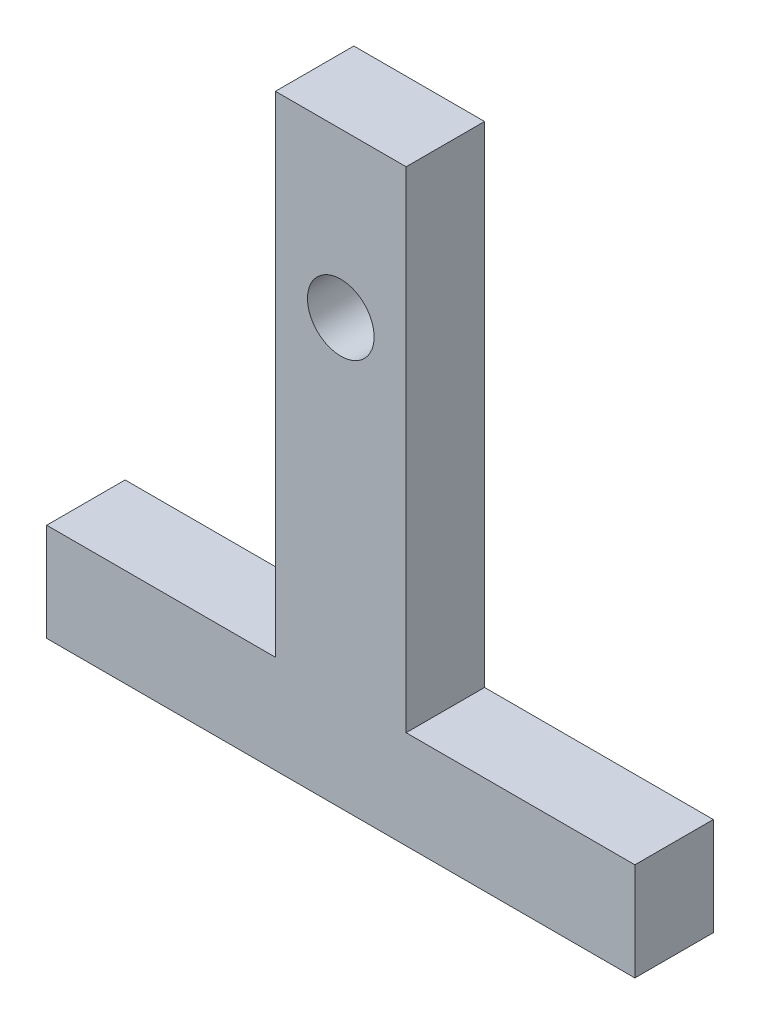
ISO-10303-21;
HEADER;
FILE_DESCRIPTION(('STEP AP214'),'2;1');
FILE_NAME('part.step','',(''),(''),'','','');
FILE_SCHEMA(('AUTOMOTIVE_DESIGN { 1 0 10303 214 1 1 1 1 }'));
ENDSEC;
DATA;
#1=APPLICATION_CONTEXT('core data for automotive mechanical design processes');
#2=APPLICATION_PROTOCOL_DEFINITION('international standard','automotive_design',2000,#1);
#3=PRODUCT_CONTEXT('',#1,'mechanical');
#4=PRODUCT('Part','Part','',(#3));
#5=PRODUCT_RELATED_PRODUCT_CATEGORY('part','',(#4));
#6=PRODUCT_DEFINITION_FORMATION('','',#4);
#7=PRODUCT_DEFINITION_CONTEXT('part definition',#1,'design');
#8=PRODUCT_DEFINITION('design','',#6,#7);
#9=PRODUCT_DEFINITION_SHAPE('','',#8);
#10=(LENGTH_UNIT() NAMED_UNIT(*) SI_UNIT(.MILLI.,.METRE.));
#11=(NAMED_UNIT(*) PLANE_ANGLE_UNIT() SI_UNIT($,.RADIAN.));
#12=(NAMED_UNIT(*) SI_UNIT($,.STERADIAN.) SOLID_ANGLE_UNIT());
#13=UNCERTAINTY_MEASURE_WITH_UNIT(LENGTH_MEASURE(1.E-05),#10,'distance_accuracy_value','');
#14=(GEOMETRIC_REPRESENTATION_CONTEXT(3) GLOBAL_UNCERTAINTY_ASSIGNED_CONTEXT((#13)) GLOBAL_UNIT_ASSIGNED_CONTEXT((#10,
#11,#12)) REPRESENTATION_CONTEXT('',''));
#15=CARTESIAN_POINT('',(0.,0.,0.));
#16=DIRECTION('',(0.,0.,1.));
#17=DIRECTION('',(1.,0.,0.));
#18=AXIS2_PLACEMENT_3D('',#15,#16,#17);
#19=CARTESIAN_POINT('',(0.,0.,12.));
#20=DIRECTION('',(0.,0.,1.));
#21=DIRECTION('',(1.,0.,0.));
#22=AXIS2_PLACEMENT_3D('',#19,#20,#21);
#23=PLANE('',#22);
#24=DIRECTION('',(0.,-1.,0.));
#25=VECTOR('',#24,1.);
#26=CARTESIAN_POINT('',(-45.,15.,12.));
#27=LINE('',#26,#25);
#28=CARTESIAN_POINT('',(-45.,15.,12.));
#29=VERTEX_POINT('',#28);
#30=CARTESIAN_POINT('',(-45.,0.,12.));
#31=VERTEX_POINT('',#30);
#32=EDGE_CURVE('E153',#29,#31,#27,.T.);
#33=ORIENTED_EDGE('',*,*,#32,.T.);
#34=DIRECTION('',(1.,0.,0.));
#35=VECTOR('',#34,1.);
#36=CARTESIAN_POINT('',(-45.,0.,12.));
#37=LINE('',#36,#35);
#38=CARTESIAN_POINT('',(45.,0.,12.));
#39=VERTEX_POINT('',#38);
#40=EDGE_CURVE('E101',#31,#39,#37,.T.);
#41=ORIENTED_EDGE('',*,*,#40,.T.);
#42=DIRECTION('',(0.,1.,0.));
#43=VECTOR('',#42,1.);
#44=CARTESIAN_POINT('',(45.,0.,12.));
#45=LINE('',#44,#43);
#46=CARTESIAN_POINT('',(45.,15.,12.));
#47=VERTEX_POINT('',#46);
#48=EDGE_CURVE('E168',#39,#47,#45,.T.);
#49=ORIENTED_EDGE('',*,*,#48,.T.);
#50=DIRECTION('',(-1.,0.,0.));
#51=VECTOR('',#50,1.);
#52=CARTESIAN_POINT('',(45.,15.,12.));
#53=LINE('',#52,#51);
#54=CARTESIAN_POINT('',(10.,15.,12.));
#55=VERTEX_POINT('',#54);
#56=EDGE_CURVE('E181',#47,#55,#53,.T.);
#57=ORIENTED_EDGE('',*,*,#56,.T.);
#58=DIRECTION('',(0.,1.,0.));
#59=VECTOR('',#58,1.);
#60=CARTESIAN_POINT('',(10.,15.,12.));
#61=LINE('',#60,#59);
#62=CARTESIAN_POINT('',(10.,90.,12.));
#63=VERTEX_POINT('',#62);
#64=EDGE_CURVE('E120',#55,#63,#61,.T.);
#65=ORIENTED_EDGE('',*,*,#64,.T.);
#66=DIRECTION('',(-1.,0.,0.));
#67=VECTOR('',#66,1.);
#68=CARTESIAN_POINT('',(10.,90.,12.));
#69=LINE('',#68,#67);
#70=CARTESIAN_POINT('',(-10.,90.,12.));
#71=VERTEX_POINT('',#70);
#72=EDGE_CURVE('E114',#63,#71,#69,.T.);
#73=ORIENTED_EDGE('',*,*,#72,.T.);
#74=DIRECTION('',(0.,-1.,0.));
#75=VECTOR('',#74,1.);
#76=CARTESIAN_POINT('',(-10.,90.,12.));
#77=LINE('',#76,#75);
#78=CARTESIAN_POINT('',(-10.,15.,12.));
#79=VERTEX_POINT('',#78);
#80=EDGE_CURVE('E118',#71,#79,#77,.T.);
#81=ORIENTED_EDGE('',*,*,#80,.T.);
#82=DIRECTION('',(-1.,0.,0.));
#83=VECTOR('',#82,1.);
#84=CARTESIAN_POINT('',(-10.,15.,12.));
#85=LINE('',#84,#83);
#86=EDGE_CURVE('E58',#79,#29,#85,.T.);
#87=ORIENTED_EDGE('',*,*,#86,.T.);
#88=EDGE_LOOP('',(#33,#41,#49,#57,#65,#73,#81,#87));
#89=FACE_BOUND('',#88,.T.);
#90=CARTESIAN_POINT('',(0.,65.,12.));
#91=DIRECTION('',(0.,0.,1.));
#92=DIRECTION('',(1.,0.,0.));
#93=AXIS2_PLACEMENT_3D('',#90,#91,#92);
#94=CIRCLE('',#93,5.1);
#95=CARTESIAN_POINT('',(5.1,65.,12.));
#96=VERTEX_POINT('',#95);
#97=EDGE_CURVE('E142',#96,#96,#94,.T.);
#98=ORIENTED_EDGE('',*,*,#97,.F.);
#99=EDGE_LOOP('',(#98));
#100=FACE_BOUND('',#99,.T.);
#101=ADVANCED_FACE('F41',(#89,#100),#23,.T.);
#102=CARTESIAN_POINT('',(0.,0.,0.));
#103=DIRECTION('',(0.,0.,1.));
#104=DIRECTION('',(1.,0.,0.));
#105=AXIS2_PLACEMENT_3D('',#102,#103,#104);
#106=PLANE('',#105);
#107=DIRECTION('',(0.,-1.,0.));
#108=VECTOR('',#107,1.);
#109=CARTESIAN_POINT('',(-45.,15.,0.));
#110=LINE('',#109,#108);
#111=CARTESIAN_POINT('',(-45.,15.,0.));
#112=VERTEX_POINT('',#111);
#113=CARTESIAN_POINT('',(-45.,0.,0.));
#114=VERTEX_POINT('',#113);
#115=EDGE_CURVE('E138',#112,#114,#110,.T.);
#116=ORIENTED_EDGE('',*,*,#115,.F.);
#117=DIRECTION('',(-1.,0.,0.));
#118=VECTOR('',#117,1.);
#119=CARTESIAN_POINT('',(-10.,15.,0.));
#120=LINE('',#119,#118);
#121=CARTESIAN_POINT('',(-10.,15.,0.));
#122=VERTEX_POINT('',#121);
#123=EDGE_CURVE('E93',#122,#112,#120,.T.);
#124=ORIENTED_EDGE('',*,*,#123,.F.);
#125=DIRECTION('',(0.,-1.,0.));
#126=VECTOR('',#125,1.);
#127=CARTESIAN_POINT('',(-10.,90.,0.));
#128=LINE('',#127,#126);
#129=CARTESIAN_POINT('',(-10.,90.,0.));
#130=VERTEX_POINT('',#129);
#131=EDGE_CURVE('E87',#130,#122,#128,.T.);
#132=ORIENTED_EDGE('',*,*,#131,.F.);
#133=DIRECTION('',(-1.,0.,0.));
#134=VECTOR('',#133,1.);
#135=CARTESIAN_POINT('',(10.,90.,0.));
#136=LINE('',#135,#134);
#137=CARTESIAN_POINT('',(10.,90.,0.));
#138=VERTEX_POINT('',#137);
#139=EDGE_CURVE('E128',#138,#130,#136,.T.);
#140=ORIENTED_EDGE('',*,*,#139,.F.);
#141=DIRECTION('',(0.,1.,0.));
#142=VECTOR('',#141,1.);
#143=CARTESIAN_POINT('',(10.,15.,0.));
#144=LINE('',#143,#142);
#145=CARTESIAN_POINT('',(10.,15.,0.));
#146=VERTEX_POINT('',#145);
#147=EDGE_CURVE('E148',#146,#138,#144,.T.);
#148=ORIENTED_EDGE('',*,*,#147,.F.);
#149=DIRECTION('',(-1.,0.,0.));
#150=VECTOR('',#149,1.);
#151=CARTESIAN_POINT('',(45.,15.,0.));
#152=LINE('',#151,#150);
#153=CARTESIAN_POINT('',(45.,15.,0.));
#154=VERTEX_POINT('',#153);
#155=EDGE_CURVE('E146',#154,#146,#152,.T.);
#156=ORIENTED_EDGE('',*,*,#155,.F.);
#157=DIRECTION('',(0.,1.,0.));
#158=VECTOR('',#157,1.);
#159=CARTESIAN_POINT('',(45.,0.,0.));
#160=LINE('',#159,#158);
#161=CARTESIAN_POINT('',(45.,0.,0.));
#162=VERTEX_POINT('',#161);
#163=EDGE_CURVE('E144',#162,#154,#160,.T.);
#164=ORIENTED_EDGE('',*,*,#163,.F.);
#165=DIRECTION('',(1.,0.,0.));
#166=VECTOR('',#165,1.);
#167=CARTESIAN_POINT('',(-45.,0.,0.));
#168=LINE('',#167,#166);
#169=EDGE_CURVE('E141',#114,#162,#168,.T.);
#170=ORIENTED_EDGE('',*,*,#169,.F.);
#171=EDGE_LOOP('',(#116,#124,#132,#140,#148,#156,#164,#170));
#172=FACE_BOUND('',#171,.T.);
#173=CARTESIAN_POINT('',(0.,65.,0.));
#174=DIRECTION('',(0.,0.,1.));
#175=DIRECTION('',(1.,0.,0.));
#176=AXIS2_PLACEMENT_3D('',#173,#174,#175);
#177=CIRCLE('',#176,5.1);
#178=CARTESIAN_POINT('',(5.1,65.,0.));
#179=VERTEX_POINT('',#178);
#180=EDGE_CURVE('E187',#179,#179,#177,.T.);
#181=ORIENTED_EDGE('',*,*,#180,.T.);
#182=EDGE_LOOP('',(#181));
#183=FACE_BOUND('',#182,.T.);
#184=ADVANCED_FACE('F172',(#172,#183),#106,.F.);
#185=CARTESIAN_POINT('',(-45.,15.,12.));
#186=DIRECTION('',(1.,0.,0.));
#187=DIRECTION('',(0.,0.,-1.));
#188=AXIS2_PLACEMENT_3D('',#185,#186,#187);
#189=PLANE('',#188);
#190=ORIENTED_EDGE('',*,*,#115,.T.);
#191=DIRECTION('',(0.,0.,-1.));
#192=VECTOR('',#191,1.);
#193=CARTESIAN_POINT('',(-45.,0.,12.));
#194=LINE('',#193,#192);
#195=EDGE_CURVE('E11',#31,#114,#194,.T.);
#196=ORIENTED_EDGE('',*,*,#195,.F.);
#197=ORIENTED_EDGE('',*,*,#32,.F.);
#198=DIRECTION('',(0.,0.,-1.));
#199=VECTOR('',#198,1.);
#200=CARTESIAN_POINT('',(-45.,15.,12.));
#201=LINE('',#200,#199);
#202=EDGE_CURVE('E134',#29,#112,#201,.T.);
#203=ORIENTED_EDGE('',*,*,#202,.T.);
#204=EDGE_LOOP('',(#190,#196,#197,#203));
#205=FACE_BOUND('',#204,.T.);
#206=ADVANCED_FACE('F43',(#205),#189,.F.);
#207=CARTESIAN_POINT('',(-45.,0.,12.));
#208=DIRECTION('',(0.,1.,0.));
#209=DIRECTION('',(0.,0.,1.));
#210=AXIS2_PLACEMENT_3D('',#207,#208,#209);
#211=PLANE('',#210);
#212=ORIENTED_EDGE('',*,*,#169,.T.);
#213=DIRECTION('',(0.,0.,-1.));
#214=VECTOR('',#213,1.);
#215=CARTESIAN_POINT('',(45.,0.,12.));
#216=LINE('',#215,#214);
#217=EDGE_CURVE('E50',#39,#162,#216,.T.);
#218=ORIENTED_EDGE('',*,*,#217,.F.);
#219=ORIENTED_EDGE('',*,*,#40,.F.);
#220=ORIENTED_EDGE('',*,*,#195,.T.);
#221=EDGE_LOOP('',(#212,#218,#219,#220));
#222=FACE_BOUND('',#221,.T.);
#223=ADVANCED_FACE('F215',(#222),#211,.F.);
#224=CARTESIAN_POINT('',(45.,0.,12.));
#225=DIRECTION('',(-1.,0.,0.));
#226=DIRECTION('',(0.,0.,1.));
#227=AXIS2_PLACEMENT_3D('',#224,#225,#226);
#228=PLANE('',#227);
#229=ORIENTED_EDGE('',*,*,#163,.T.);
#230=DIRECTION('',(0.,0.,-1.));
#231=VECTOR('',#230,1.);
#232=CARTESIAN_POINT('',(45.,15.,12.));
#233=LINE('',#232,#231);
#234=EDGE_CURVE('E160',#47,#154,#233,.T.);
#235=ORIENTED_EDGE('',*,*,#234,.F.);
#236=ORIENTED_EDGE('',*,*,#48,.F.);
#237=ORIENTED_EDGE('',*,*,#217,.T.);
#238=EDGE_LOOP('',(#229,#235,#236,#237));
#239=FACE_BOUND('',#238,.T.);
#240=ADVANCED_FACE('F166',(#239),#228,.F.);
#241=CARTESIAN_POINT('',(45.,15.,12.));
#242=DIRECTION('',(0.,-1.,0.));
#243=DIRECTION('',(0.,0.,-1.));
#244=AXIS2_PLACEMENT_3D('',#241,#242,#243);
#245=PLANE('',#244);
#246=ORIENTED_EDGE('',*,*,#155,.T.);
#247=DIRECTION('',(0.,0.,-1.));
#248=VECTOR('',#247,1.);
#249=CARTESIAN_POINT('',(10.,15.,12.));
#250=LINE('',#249,#248);
#251=EDGE_CURVE('E157',#55,#146,#250,.T.);
#252=ORIENTED_EDGE('',*,*,#251,.F.);
#253=ORIENTED_EDGE('',*,*,#56,.F.);
#254=ORIENTED_EDGE('',*,*,#234,.T.);
#255=EDGE_LOOP('',(#246,#252,#253,#254));
#256=FACE_BOUND('',#255,.T.);
#257=ADVANCED_FACE('F177',(#256),#245,.F.);
#258=CARTESIAN_POINT('',(10.,15.,12.));
#259=DIRECTION('',(-1.,0.,0.));
#260=DIRECTION('',(0.,0.,1.));
#261=AXIS2_PLACEMENT_3D('',#258,#259,#260);
#262=PLANE('',#261);
#263=ORIENTED_EDGE('',*,*,#147,.T.);
#264=DIRECTION('',(0.,0.,-1.));
#265=VECTOR('',#264,1.);
#266=CARTESIAN_POINT('',(10.,90.,12.));
#267=LINE('',#266,#265);
#268=EDGE_CURVE('E129',#63,#138,#267,.T.);
#269=ORIENTED_EDGE('',*,*,#268,.F.);
#270=ORIENTED_EDGE('',*,*,#64,.F.);
#271=ORIENTED_EDGE('',*,*,#251,.T.);
#272=EDGE_LOOP('',(#263,#269,#270,#271));
#273=FACE_BOUND('',#272,.T.);
#274=ADVANCED_FACE('F180',(#273),#262,.F.);
#275=CARTESIAN_POINT('',(10.,90.,12.));
#276=DIRECTION('',(0.,-1.,0.));
#277=DIRECTION('',(0.,0.,-1.));
#278=AXIS2_PLACEMENT_3D('',#275,#276,#277);
#279=PLANE('',#278);
#280=ORIENTED_EDGE('',*,*,#139,.T.);
#281=DIRECTION('',(0.,0.,-1.));
#282=VECTOR('',#281,1.);
#283=CARTESIAN_POINT('',(-10.,90.,12.));
#284=LINE('',#283,#282);
#285=EDGE_CURVE('E125',#71,#130,#284,.T.);
#286=ORIENTED_EDGE('',*,*,#285,.F.);
#287=ORIENTED_EDGE('',*,*,#72,.F.);
#288=ORIENTED_EDGE('',*,*,#268,.T.);
#289=EDGE_LOOP('',(#280,#286,#287,#288));
#290=FACE_BOUND('',#289,.T.);
#291=ADVANCED_FACE('F126',(#290),#279,.F.);
#292=CARTESIAN_POINT('',(-10.,90.,12.));
#293=DIRECTION('',(1.,0.,0.));
#294=DIRECTION('',(0.,0.,-1.));
#295=AXIS2_PLACEMENT_3D('',#292,#293,#294);
#296=PLANE('',#295);
#297=ORIENTED_EDGE('',*,*,#131,.T.);
#298=DIRECTION('',(0.,0.,-1.));
#299=VECTOR('',#298,1.);
#300=CARTESIAN_POINT('',(-10.,15.,12.));
#301=LINE('',#300,#299);
#302=EDGE_CURVE('E130',#79,#122,#301,.T.);
#303=ORIENTED_EDGE('',*,*,#302,.F.);
#304=ORIENTED_EDGE('',*,*,#80,.F.);
#305=ORIENTED_EDGE('',*,*,#285,.T.);
#306=EDGE_LOOP('',(#297,#303,#304,#305));
#307=FACE_BOUND('',#306,.T.);
#308=ADVANCED_FACE('F132',(#307),#296,.F.);
#309=CARTESIAN_POINT('',(-10.,15.,12.));
#310=DIRECTION('',(0.,-1.,0.));
#311=DIRECTION('',(0.,0.,-1.));
#312=AXIS2_PLACEMENT_3D('',#309,#310,#311);
#313=PLANE('',#312);
#314=ORIENTED_EDGE('',*,*,#123,.T.);
#315=ORIENTED_EDGE('',*,*,#202,.F.);
#316=ORIENTED_EDGE('',*,*,#86,.F.);
#317=ORIENTED_EDGE('',*,*,#302,.T.);
#318=EDGE_LOOP('',(#314,#315,#316,#317));
#319=FACE_BOUND('',#318,.T.);
#320=ADVANCED_FACE('F203',(#319),#313,.F.);
#321=CARTESIAN_POINT('',(0.,65.,12.));
#322=DIRECTION('',(0.,0.,-1.));
#323=DIRECTION('',(-1.,0.,0.));
#324=AXIS2_PLACEMENT_3D('',#321,#322,#323);
#325=CYLINDRICAL_SURFACE('',#324,5.1);
#326=ORIENTED_EDGE('',*,*,#97,.T.);
#327=EDGE_LOOP('',(#326));
#328=FACE_BOUND('',#327,.T.);
#329=ORIENTED_EDGE('',*,*,#180,.F.);
#330=EDGE_LOOP('',(#329));
#331=FACE_BOUND('',#330,.T.);
#332=ADVANCED_FACE('F193',(#328,#331),#325,.F.);
#333=CLOSED_SHELL('',(#101,#184,#206,#223,#240,#257,#274,#291,#308,#320,#332));
#334=MANIFOLD_SOLID_BREP('B2',#333);
#335=ADVANCED_BREP_SHAPE_REPRESENTATION('',(#18,#334),#14);
#336=SHAPE_DEFINITION_REPRESENTATION(#9,#335);
ENDSEC;
END-ISO-10303-21;
